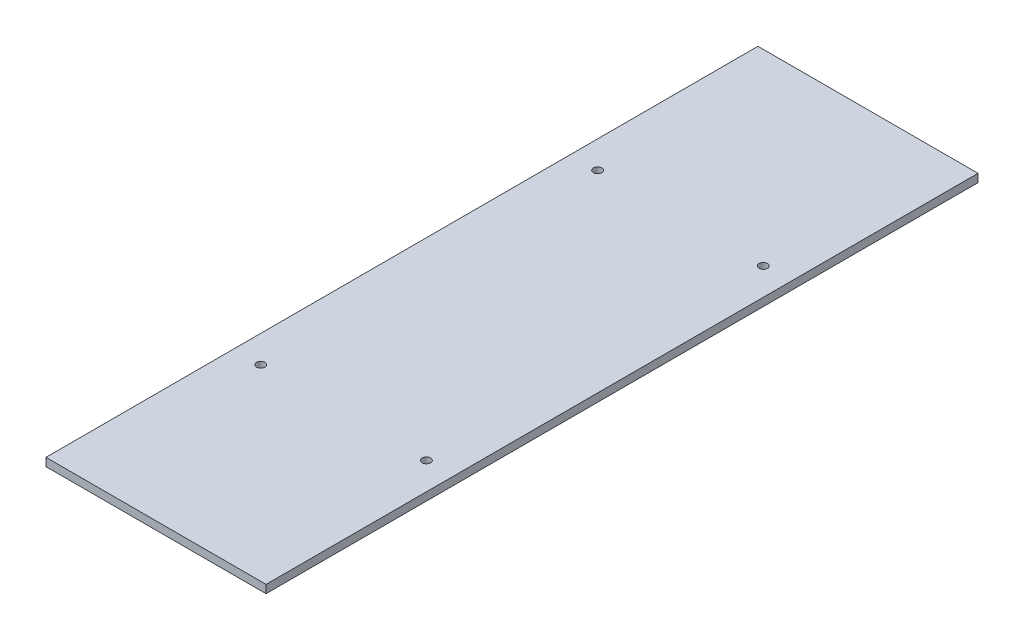
ISO-10303-21;
HEADER;
FILE_DESCRIPTION(('STEP AP214'),'2;1');
FILE_NAME('part.step','',(''),(''),'','','');
FILE_SCHEMA(('AUTOMOTIVE_DESIGN { 1 0 10303 214 1 1 1 1 }'));
ENDSEC;
DATA;
#1=APPLICATION_CONTEXT('core data for automotive mechanical design processes');
#2=APPLICATION_PROTOCOL_DEFINITION('international standard','automotive_design',2000,#1);
#3=PRODUCT_CONTEXT('',#1,'mechanical');
#4=PRODUCT('Part','Part','',(#3));
#5=PRODUCT_RELATED_PRODUCT_CATEGORY('part','',(#4));
#6=PRODUCT_DEFINITION_FORMATION('','',#4);
#7=PRODUCT_DEFINITION_CONTEXT('part definition',#1,'design');
#8=PRODUCT_DEFINITION('design','',#6,#7);
#9=PRODUCT_DEFINITION_SHAPE('','',#8);
#10=(LENGTH_UNIT() NAMED_UNIT(*) SI_UNIT(.MILLI.,.METRE.));
#11=(NAMED_UNIT(*) PLANE_ANGLE_UNIT() SI_UNIT($,.RADIAN.));
#12=(NAMED_UNIT(*) SI_UNIT($,.STERADIAN.) SOLID_ANGLE_UNIT());
#13=UNCERTAINTY_MEASURE_WITH_UNIT(LENGTH_MEASURE(1.E-05),#10,'distance_accuracy_value','');
#14=(GEOMETRIC_REPRESENTATION_CONTEXT(3) GLOBAL_UNCERTAINTY_ASSIGNED_CONTEXT((#13)) GLOBAL_UNIT_ASSIGNED_CONTEXT((#10,
#11,#12)) REPRESENTATION_CONTEXT('',''));
#15=CARTESIAN_POINT('',(0.,0.,0.));
#16=DIRECTION('',(0.,0.,1.));
#17=DIRECTION('',(1.,0.,0.));
#18=AXIS2_PLACEMENT_3D('',#15,#16,#17);
#19=CARTESIAN_POINT('',(0.,3.175,0.));
#20=DIRECTION('',(0.,1.,0.));
#21=DIRECTION('',(0.,0.,1.));
#22=AXIS2_PLACEMENT_3D('',#19,#20,#21);
#23=PLANE('',#22);
#24=CARTESIAN_POINT('',(32.5,3.175,66.1));
#25=DIRECTION('',(0.,1.,0.));
#26=DIRECTION('',(0.,0.,1.));
#27=AXIS2_PLACEMENT_3D('',#24,#25,#26);
#28=CIRCLE('',#27,1.65);
#29=CARTESIAN_POINT('',(32.5,3.175,67.75));
#30=VERTEX_POINT('',#29);
#31=EDGE_CURVE('E121',#30,#30,#28,.T.);
#32=ORIENTED_EDGE('',*,*,#31,.F.);
#33=EDGE_LOOP('',(#32));
#34=FACE_BOUND('',#33,.T.);
#35=CARTESIAN_POINT('',(-32.5,3.175,-66.1));
#36=DIRECTION('',(0.,1.,0.));
#37=DIRECTION('',(0.,0.,1.));
#38=AXIS2_PLACEMENT_3D('',#35,#36,#37);
#39=CIRCLE('',#38,1.65);
#40=CARTESIAN_POINT('',(-32.5,3.175,-64.45));
#41=VERTEX_POINT('',#40);
#42=EDGE_CURVE('E100',#41,#41,#39,.T.);
#43=ORIENTED_EDGE('',*,*,#42,.F.);
#44=EDGE_LOOP('',(#43));
#45=FACE_BOUND('',#44,.T.);
#46=DIRECTION('',(0.,0.,-1.));
#47=VECTOR('',#46,1.);
#48=CARTESIAN_POINT('',(43.175,3.175,-139.7));
#49=LINE('',#48,#47);
#50=CARTESIAN_POINT('',(43.175,3.175,139.7));
#51=VERTEX_POINT('',#50);
#52=CARTESIAN_POINT('',(43.175,3.175,-139.7));
#53=VERTEX_POINT('',#52);
#54=EDGE_CURVE('E85',#51,#53,#49,.T.);
#55=ORIENTED_EDGE('',*,*,#54,.T.);
#56=DIRECTION('',(-1.,0.,0.));
#57=VECTOR('',#56,1.);
#58=CARTESIAN_POINT('',(-43.175,3.175,-139.7));
#59=LINE('',#58,#57);
#60=CARTESIAN_POINT('',(-43.175,3.175,-139.7));
#61=VERTEX_POINT('',#60);
#62=EDGE_CURVE('E80',#53,#61,#59,.T.);
#63=ORIENTED_EDGE('',*,*,#62,.T.);
#64=DIRECTION('',(0.,0.,1.));
#65=VECTOR('',#64,1.);
#66=CARTESIAN_POINT('',(-43.175,3.175,-139.7));
#67=LINE('',#66,#65);
#68=CARTESIAN_POINT('',(-43.175,3.175,139.7));
#69=VERTEX_POINT('',#68);
#70=EDGE_CURVE('E83',#61,#69,#67,.T.);
#71=ORIENTED_EDGE('',*,*,#70,.T.);
#72=DIRECTION('',(1.,0.,0.));
#73=VECTOR('',#72,1.);
#74=CARTESIAN_POINT('',(-43.175,3.175,139.7));
#75=LINE('',#74,#73);
#76=EDGE_CURVE('E50',#69,#51,#75,.T.);
#77=ORIENTED_EDGE('',*,*,#76,.T.);
#78=EDGE_LOOP('',(#55,#63,#71,#77));
#79=FACE_BOUND('',#78,.T.);
#80=CARTESIAN_POINT('',(32.5,3.175,-66.1));
#81=DIRECTION('',(0.,1.,0.));
#82=DIRECTION('',(0.,0.,-1.));
#83=AXIS2_PLACEMENT_3D('',#80,#81,#82);
#84=CIRCLE('',#83,1.65);
#85=CARTESIAN_POINT('',(32.5,3.175,-67.75));
#86=VERTEX_POINT('',#85);
#87=EDGE_CURVE('E115',#86,#86,#84,.T.);
#88=ORIENTED_EDGE('',*,*,#87,.F.);
#89=EDGE_LOOP('',(#88));
#90=FACE_BOUND('',#89,.T.);
#91=CARTESIAN_POINT('',(-32.5,3.175,66.1));
#92=DIRECTION('',(0.,1.,0.));
#93=DIRECTION('',(0.,0.,-1.));
#94=AXIS2_PLACEMENT_3D('',#91,#92,#93);
#95=CIRCLE('',#94,1.65);
#96=CARTESIAN_POINT('',(-32.5,3.175,64.45));
#97=VERTEX_POINT('',#96);
#98=EDGE_CURVE('E127',#97,#97,#95,.T.);
#99=ORIENTED_EDGE('',*,*,#98,.F.);
#100=EDGE_LOOP('',(#99));
#101=FACE_BOUND('',#100,.T.);
#102=ADVANCED_FACE('F33',(#34,#45,#79,#90,#101),#23,.T.);
#103=CARTESIAN_POINT('',(0.,0.,0.));
#104=DIRECTION('',(0.,1.,0.));
#105=DIRECTION('',(0.,0.,1.));
#106=AXIS2_PLACEMENT_3D('',#103,#104,#105);
#107=PLANE('',#106);
#108=DIRECTION('',(0.,0.,-1.));
#109=VECTOR('',#108,1.);
#110=CARTESIAN_POINT('',(43.175,0.,-139.7));
#111=LINE('',#110,#109);
#112=CARTESIAN_POINT('',(43.175,0.,139.7));
#113=VERTEX_POINT('',#112);
#114=CARTESIAN_POINT('',(43.175,0.,-139.7));
#115=VERTEX_POINT('',#114);
#116=EDGE_CURVE('E97',#113,#115,#111,.T.);
#117=ORIENTED_EDGE('',*,*,#116,.F.);
#118=DIRECTION('',(1.,0.,0.));
#119=VECTOR('',#118,1.);
#120=CARTESIAN_POINT('',(-43.175,0.,139.7));
#121=LINE('',#120,#119);
#122=CARTESIAN_POINT('',(-43.175,0.,139.7));
#123=VERTEX_POINT('',#122);
#124=EDGE_CURVE('E73',#123,#113,#121,.T.);
#125=ORIENTED_EDGE('',*,*,#124,.F.);
#126=DIRECTION('',(0.,0.,1.));
#127=VECTOR('',#126,1.);
#128=CARTESIAN_POINT('',(-43.175,0.,-139.7));
#129=LINE('',#128,#127);
#130=CARTESIAN_POINT('',(-43.175,0.,-139.7));
#131=VERTEX_POINT('',#130);
#132=EDGE_CURVE('E67',#131,#123,#129,.T.);
#133=ORIENTED_EDGE('',*,*,#132,.F.);
#134=DIRECTION('',(-1.,0.,0.));
#135=VECTOR('',#134,1.);
#136=CARTESIAN_POINT('',(-43.175,0.,-139.7));
#137=LINE('',#136,#135);
#138=EDGE_CURVE('E89',#115,#131,#137,.T.);
#139=ORIENTED_EDGE('',*,*,#138,.F.);
#140=EDGE_LOOP('',(#117,#125,#133,#139));
#141=FACE_BOUND('',#140,.T.);
#142=CARTESIAN_POINT('',(-32.5,0.,-66.1));
#143=DIRECTION('',(0.,1.,0.));
#144=DIRECTION('',(0.,0.,1.));
#145=AXIS2_PLACEMENT_3D('',#142,#143,#144);
#146=CIRCLE('',#145,1.65);
#147=CARTESIAN_POINT('',(-32.5,0.,-64.45));
#148=VERTEX_POINT('',#147);
#149=EDGE_CURVE('E112',#148,#148,#146,.T.);
#150=ORIENTED_EDGE('',*,*,#149,.T.);
#151=EDGE_LOOP('',(#150));
#152=FACE_BOUND('',#151,.T.);
#153=CARTESIAN_POINT('',(32.5,0.,-66.1));
#154=DIRECTION('',(0.,1.,0.));
#155=DIRECTION('',(0.,0.,-1.));
#156=AXIS2_PLACEMENT_3D('',#153,#154,#155);
#157=CIRCLE('',#156,1.65);
#158=CARTESIAN_POINT('',(32.5,0.,-67.75));
#159=VERTEX_POINT('',#158);
#160=EDGE_CURVE('E118',#159,#159,#157,.T.);
#161=ORIENTED_EDGE('',*,*,#160,.T.);
#162=EDGE_LOOP('',(#161));
#163=FACE_BOUND('',#162,.T.);
#164=CARTESIAN_POINT('',(32.5,0.,66.1));
#165=DIRECTION('',(0.,1.,0.));
#166=DIRECTION('',(0.,0.,1.));
#167=AXIS2_PLACEMENT_3D('',#164,#165,#166);
#168=CIRCLE('',#167,1.65);
#169=CARTESIAN_POINT('',(32.5,0.,67.75));
#170=VERTEX_POINT('',#169);
#171=EDGE_CURVE('E124',#170,#170,#168,.T.);
#172=ORIENTED_EDGE('',*,*,#171,.T.);
#173=EDGE_LOOP('',(#172));
#174=FACE_BOUND('',#173,.T.);
#175=CARTESIAN_POINT('',(-32.5,0.,66.1));
#176=DIRECTION('',(0.,1.,0.));
#177=DIRECTION('',(0.,0.,-1.));
#178=AXIS2_PLACEMENT_3D('',#175,#176,#177);
#179=CIRCLE('',#178,1.65);
#180=CARTESIAN_POINT('',(-32.5,0.,64.45));
#181=VERTEX_POINT('',#180);
#182=EDGE_CURVE('E130',#181,#181,#179,.T.);
#183=ORIENTED_EDGE('',*,*,#182,.T.);
#184=EDGE_LOOP('',(#183));
#185=FACE_BOUND('',#184,.T.);
#186=ADVANCED_FACE('F108',(#141,#152,#163,#174,#185),#107,.F.);
#187=CARTESIAN_POINT('',(43.175,3.175,-139.7));
#188=DIRECTION('',(-1.,0.,0.));
#189=DIRECTION('',(0.,0.,1.));
#190=AXIS2_PLACEMENT_3D('',#187,#188,#189);
#191=PLANE('',#190);
#192=ORIENTED_EDGE('',*,*,#116,.T.);
#193=DIRECTION('',(0.,-1.,0.));
#194=VECTOR('',#193,1.);
#195=CARTESIAN_POINT('',(43.175,3.175,-139.7));
#196=LINE('',#195,#194);
#197=EDGE_CURVE('E11',#53,#115,#196,.T.);
#198=ORIENTED_EDGE('',*,*,#197,.F.);
#199=ORIENTED_EDGE('',*,*,#54,.F.);
#200=DIRECTION('',(0.,-1.,0.));
#201=VECTOR('',#200,1.);
#202=CARTESIAN_POINT('',(43.175,3.175,139.7));
#203=LINE('',#202,#201);
#204=EDGE_CURVE('E93',#51,#113,#203,.T.);
#205=ORIENTED_EDGE('',*,*,#204,.T.);
#206=EDGE_LOOP('',(#192,#198,#199,#205));
#207=FACE_BOUND('',#206,.T.);
#208=ADVANCED_FACE('F35',(#207),#191,.F.);
#209=CARTESIAN_POINT('',(-43.175,3.175,-139.7));
#210=DIRECTION('',(0.,0.,1.));
#211=DIRECTION('',(1.,0.,0.));
#212=AXIS2_PLACEMENT_3D('',#209,#210,#211);
#213=PLANE('',#212);
#214=ORIENTED_EDGE('',*,*,#138,.T.);
#215=DIRECTION('',(0.,-1.,0.));
#216=VECTOR('',#215,1.);
#217=CARTESIAN_POINT('',(-43.175,3.175,-139.7));
#218=LINE('',#217,#216);
#219=EDGE_CURVE('E42',#61,#131,#218,.T.);
#220=ORIENTED_EDGE('',*,*,#219,.F.);
#221=ORIENTED_EDGE('',*,*,#62,.F.);
#222=ORIENTED_EDGE('',*,*,#197,.T.);
#223=EDGE_LOOP('',(#214,#220,#221,#222));
#224=FACE_BOUND('',#223,.T.);
#225=ADVANCED_FACE('F88',(#224),#213,.F.);
#226=CARTESIAN_POINT('',(-43.175,3.175,-139.7));
#227=DIRECTION('',(1.,0.,0.));
#228=DIRECTION('',(0.,0.,-1.));
#229=AXIS2_PLACEMENT_3D('',#226,#227,#228);
#230=PLANE('',#229);
#231=ORIENTED_EDGE('',*,*,#132,.T.);
#232=DIRECTION('',(0.,-1.,0.));
#233=VECTOR('',#232,1.);
#234=CARTESIAN_POINT('',(-43.175,3.175,139.7));
#235=LINE('',#234,#233);
#236=EDGE_CURVE('E90',#69,#123,#235,.T.);
#237=ORIENTED_EDGE('',*,*,#236,.F.);
#238=ORIENTED_EDGE('',*,*,#70,.F.);
#239=ORIENTED_EDGE('',*,*,#219,.T.);
#240=EDGE_LOOP('',(#231,#237,#238,#239));
#241=FACE_BOUND('',#240,.T.);
#242=ADVANCED_FACE('F91',(#241),#230,.F.);
#243=CARTESIAN_POINT('',(-43.175,3.175,139.7));
#244=DIRECTION('',(0.,0.,-1.));
#245=DIRECTION('',(-1.,0.,0.));
#246=AXIS2_PLACEMENT_3D('',#243,#244,#245);
#247=PLANE('',#246);
#248=ORIENTED_EDGE('',*,*,#124,.T.);
#249=ORIENTED_EDGE('',*,*,#204,.F.);
#250=ORIENTED_EDGE('',*,*,#76,.F.);
#251=ORIENTED_EDGE('',*,*,#236,.T.);
#252=EDGE_LOOP('',(#248,#249,#250,#251));
#253=FACE_BOUND('',#252,.T.);
#254=ADVANCED_FACE('F105',(#253),#247,.F.);
#255=CARTESIAN_POINT('',(-32.5,3.175,-66.1));
#256=DIRECTION('',(0.,-1.,0.));
#257=DIRECTION('',(0.,0.,-1.));
#258=AXIS2_PLACEMENT_3D('',#255,#256,#257);
#259=CYLINDRICAL_SURFACE('',#258,1.65);
#260=ORIENTED_EDGE('',*,*,#42,.T.);
#261=EDGE_LOOP('',(#260));
#262=FACE_BOUND('',#261,.T.);
#263=ORIENTED_EDGE('',*,*,#149,.F.);
#264=EDGE_LOOP('',(#263));
#265=FACE_BOUND('',#264,.T.);
#266=ADVANCED_FACE('F149',(#262,#265),#259,.F.);
#267=CARTESIAN_POINT('',(32.5,3.175,-66.1));
#268=DIRECTION('',(0.,-1.,0.));
#269=DIRECTION('',(0.,0.,-1.));
#270=AXIS2_PLACEMENT_3D('',#267,#268,#269);
#271=CYLINDRICAL_SURFACE('',#270,1.65);
#272=ORIENTED_EDGE('',*,*,#87,.T.);
#273=EDGE_LOOP('',(#272));
#274=FACE_BOUND('',#273,.T.);
#275=ORIENTED_EDGE('',*,*,#160,.F.);
#276=EDGE_LOOP('',(#275));
#277=FACE_BOUND('',#276,.T.);
#278=ADVANCED_FACE('F195',(#274,#277),#271,.F.);
#279=CARTESIAN_POINT('',(32.5,3.175,66.1));
#280=DIRECTION('',(0.,-1.,0.));
#281=DIRECTION('',(0.,0.,-1.));
#282=AXIS2_PLACEMENT_3D('',#279,#280,#281);
#283=CYLINDRICAL_SURFACE('',#282,1.65);
#284=ORIENTED_EDGE('',*,*,#31,.T.);
#285=EDGE_LOOP('',(#284));
#286=FACE_BOUND('',#285,.T.);
#287=ORIENTED_EDGE('',*,*,#171,.F.);
#288=EDGE_LOOP('',(#287));
#289=FACE_BOUND('',#288,.T.);
#290=ADVANCED_FACE('F203',(#286,#289),#283,.F.);
#291=CARTESIAN_POINT('',(-32.5,3.175,66.1));
#292=DIRECTION('',(0.,-1.,0.));
#293=DIRECTION('',(0.,0.,-1.));
#294=AXIS2_PLACEMENT_3D('',#291,#292,#293);
#295=CYLINDRICAL_SURFACE('',#294,1.65);
#296=ORIENTED_EDGE('',*,*,#98,.T.);
#297=EDGE_LOOP('',(#296));
#298=FACE_BOUND('',#297,.T.);
#299=ORIENTED_EDGE('',*,*,#182,.F.);
#300=EDGE_LOOP('',(#299));
#301=FACE_BOUND('',#300,.T.);
#302=ADVANCED_FACE('F136',(#298,#301),#295,.F.);
#303=CLOSED_SHELL('',(#102,#186,#208,#225,#242,#254,#266,#278,#290,#302));
#304=MANIFOLD_SOLID_BREP('B2',#303);
#305=ADVANCED_BREP_SHAPE_REPRESENTATION('',(#18,#304),#14);
#306=SHAPE_DEFINITION_REPRESENTATION(#9,#305);
ENDSEC;
END-ISO-10303-21;
